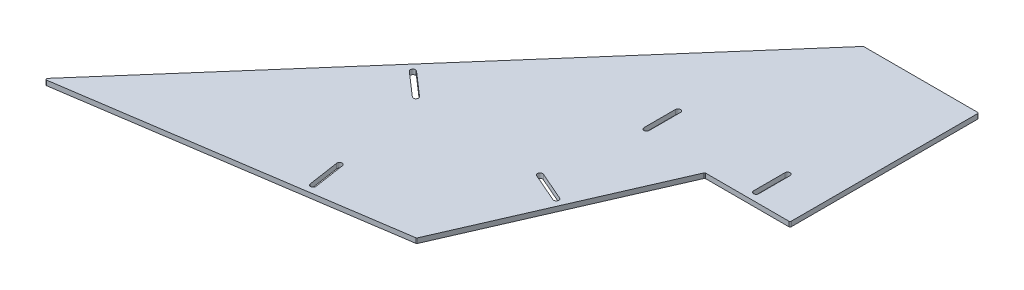
ISO-10303-21;
HEADER;
FILE_DESCRIPTION(('STEP AP214'),'2;1');
FILE_NAME('part.step','',(''),(''),'','','');
FILE_SCHEMA(('AUTOMOTIVE_DESIGN { 1 0 10303 214 1 1 1 1 }'));
ENDSEC;
DATA;
#1=APPLICATION_CONTEXT('core data for automotive mechanical design processes');
#2=APPLICATION_PROTOCOL_DEFINITION('international standard','automotive_design',2000,#1);
#3=PRODUCT_CONTEXT('',#1,'mechanical');
#4=PRODUCT('Part','Part','',(#3));
#5=PRODUCT_RELATED_PRODUCT_CATEGORY('part','',(#4));
#6=PRODUCT_DEFINITION_FORMATION('','',#4);
#7=PRODUCT_DEFINITION_CONTEXT('part definition',#1,'design');
#8=PRODUCT_DEFINITION('design','',#6,#7);
#9=PRODUCT_DEFINITION_SHAPE('','',#8);
#10=(LENGTH_UNIT() NAMED_UNIT(*) SI_UNIT(.MILLI.,.METRE.));
#11=(NAMED_UNIT(*) PLANE_ANGLE_UNIT() SI_UNIT($,.RADIAN.));
#12=(NAMED_UNIT(*) SI_UNIT($,.STERADIAN.) SOLID_ANGLE_UNIT());
#13=UNCERTAINTY_MEASURE_WITH_UNIT(LENGTH_MEASURE(1.E-05),#10,'distance_accuracy_value','');
#14=(GEOMETRIC_REPRESENTATION_CONTEXT(3) GLOBAL_UNCERTAINTY_ASSIGNED_CONTEXT((#13)) GLOBAL_UNIT_ASSIGNED_CONTEXT((#10,
#11,#12)) REPRESENTATION_CONTEXT('',''));
#15=CARTESIAN_POINT('',(0.,0.,0.));
#16=DIRECTION('',(0.,0.,1.));
#17=DIRECTION('',(1.,0.,0.));
#18=AXIS2_PLACEMENT_3D('',#15,#16,#17);
#19=CARTESIAN_POINT('',(-182.906753128615,4.,209.523292901601));
#20=DIRECTION('',(-0.657636413617563,0.,0.753335481365527));
#21=DIRECTION('',(0.753335481365527,0.,0.657636413617563));
#22=AXIS2_PLACEMENT_3D('',#19,#20,#21);
#23=PLANE('',#22);
#24=DIRECTION('',(-0.753335481365527,0.,-0.657636413617563));
#25=VECTOR('',#24,1.);
#26=CARTESIAN_POINT('',(-182.906753128615,0.,209.523292901601));
#27=LINE('',#26,#25);
#28=CARTESIAN_POINT('',(-169.472302741374,0.,221.251114025297));
#29=VERTEX_POINT('',#28);
#30=CARTESIAN_POINT('',(-188.908358160605,0.,204.284094553964));
#31=VERTEX_POINT('',#30);
#32=EDGE_CURVE('E466',#29,#31,#27,.T.);
#33=ORIENTED_EDGE('',*,*,#32,.T.);
#34=DIRECTION('',(0.,-1.,0.));
#35=VECTOR('',#34,1.);
#36=CARTESIAN_POINT('',(-188.908358160605,4.,204.284094553964));
#37=LINE('',#36,#35);
#38=CARTESIAN_POINT('',(-188.908358160605,4.,204.284094553964));
#39=VERTEX_POINT('',#38);
#40=EDGE_CURVE('E290',#39,#31,#37,.T.);
#41=ORIENTED_EDGE('',*,*,#40,.F.);
#42=DIRECTION('',(-0.753335481365527,0.,-0.657636413617563));
#43=VECTOR('',#42,1.);
#44=CARTESIAN_POINT('',(-182.906753128615,4.,209.523292901601));
#45=LINE('',#44,#43);
#46=CARTESIAN_POINT('',(-169.472302741374,4.,221.251114025297));
#47=VERTEX_POINT('',#46);
#48=EDGE_CURVE('E404',#47,#39,#45,.T.);
#49=ORIENTED_EDGE('',*,*,#48,.F.);
#50=DIRECTION('',(0.,-1.,0.));
#51=VECTOR('',#50,1.);
#52=CARTESIAN_POINT('',(-169.472302741374,4.,221.251114025297));
#53=LINE('',#52,#51);
#54=EDGE_CURVE('E478',#47,#29,#53,.T.);
#55=ORIENTED_EDGE('',*,*,#54,.T.);
#56=EDGE_LOOP('',(#33,#41,#49,#55));
#57=FACE_BOUND('',#56,.T.);
#58=ADVANCED_FACE('F41',(#57),#23,.F.);
#59=CARTESIAN_POINT('',(-187.527321692008,4.,202.702090043096));
#60=DIRECTION('',(0.,-1.,0.));
#61=DIRECTION('',(0.,0.,-1.));
#62=AXIS2_PLACEMENT_3D('',#59,#60,#61);
#63=CYLINDRICAL_SURFACE('',#62,2.10000000000001);
#64=CARTESIAN_POINT('',(-187.527321692008,0.,202.702090043096));
#65=DIRECTION('',(0.,1.,0.));
#66=DIRECTION('',(0.,0.,1.));
#67=AXIS2_PLACEMENT_3D('',#64,#65,#66);
#68=CIRCLE('',#67,2.10000000000001);
#69=CARTESIAN_POINT('',(-186.146285223411,0.,201.120085532229));
#70=VERTEX_POINT('',#69);
#71=EDGE_CURVE('E469',#31,#70,#68,.F.);
#72=ORIENTED_EDGE('',*,*,#71,.T.);
#73=DIRECTION('',(0.,-1.,0.));
#74=VECTOR('',#73,1.);
#75=CARTESIAN_POINT('',(-186.146285223411,4.,201.120085532229));
#76=LINE('',#75,#74);
#77=CARTESIAN_POINT('',(-186.146285223411,4.,201.120085532229));
#78=VERTEX_POINT('',#77);
#79=EDGE_CURVE('E484',#78,#70,#76,.T.);
#80=ORIENTED_EDGE('',*,*,#79,.F.);
#81=CARTESIAN_POINT('',(-187.527321692008,4.,202.702090043096));
#82=DIRECTION('',(0.,1.,0.));
#83=DIRECTION('',(0.,0.,1.));
#84=AXIS2_PLACEMENT_3D('',#81,#82,#83);
#85=CIRCLE('',#84,2.10000000000001);
#86=EDGE_CURVE('E407',#39,#78,#85,.F.);
#87=ORIENTED_EDGE('',*,*,#86,.F.);
#88=ORIENTED_EDGE('',*,*,#40,.T.);
#89=EDGE_LOOP('',(#72,#80,#87,#88));
#90=FACE_BOUND('',#89,.T.);
#91=ADVANCED_FACE('F534',(#90),#63,.F.);
#92=CARTESIAN_POINT('',(-180.144680191422,4.,206.359283879866));
#93=DIRECTION('',(-0.657636413617563,0.,0.753335481365527));
#94=DIRECTION('',(0.753335481365527,0.,0.657636413617563));
#95=AXIS2_PLACEMENT_3D('',#92,#93,#94);
#96=PLANE('',#95);
#97=DIRECTION('',(-0.753335481365527,0.,-0.657636413617563));
#98=VECTOR('',#97,1.);
#99=CARTESIAN_POINT('',(-180.144680191422,0.,206.359283879866));
#100=LINE('',#99,#98);
#101=CARTESIAN_POINT('',(-166.71022980418,0.,218.087105003562));
#102=VERTEX_POINT('',#101);
#103=EDGE_CURVE('E472',#102,#70,#100,.T.);
#104=ORIENTED_EDGE('',*,*,#103,.F.);
#105=DIRECTION('',(0.,-1.,0.));
#106=VECTOR('',#105,1.);
#107=CARTESIAN_POINT('',(-166.71022980418,4.,218.087105003562));
#108=LINE('',#107,#106);
#109=CARTESIAN_POINT('',(-166.71022980418,4.,218.087105003562));
#110=VERTEX_POINT('',#109);
#111=EDGE_CURVE('E481',#110,#102,#108,.T.);
#112=ORIENTED_EDGE('',*,*,#111,.F.);
#113=DIRECTION('',(-0.753335481365527,0.,-0.657636413617563));
#114=VECTOR('',#113,1.);
#115=CARTESIAN_POINT('',(-180.144680191422,4.,206.359283879866));
#116=LINE('',#115,#114);
#117=EDGE_CURVE('E409',#110,#78,#116,.T.);
#118=ORIENTED_EDGE('',*,*,#117,.T.);
#119=ORIENTED_EDGE('',*,*,#79,.T.);
#120=EDGE_LOOP('',(#104,#112,#118,#119));
#121=FACE_BOUND('',#120,.T.);
#122=ADVANCED_FACE('F540',(#121),#96,.T.);
#123=CARTESIAN_POINT('',(-193.849616683221,4.,29.0389007895047));
#124=DIRECTION('',(-0.988965179468051,0.,0.148148148148148));
#125=DIRECTION('',(0.148148148148148,0.,0.988965179468051));
#126=AXIS2_PLACEMENT_3D('',#123,#124,#125);
#127=PLANE('',#126);
#128=DIRECTION('',(-0.148148148148148,0.,-0.988965179468051));
#129=VECTOR('',#128,1.);
#130=CARTESIAN_POINT('',(-193.849616683221,0.,29.0389007895047));
#131=LINE('',#130,#129);
#132=CARTESIAN_POINT('',(-149.493127167284,0.,325.14131018874));
#133=VERTEX_POINT('',#132);
#134=CARTESIAN_POINT('',(-153.315349389507,0.,299.626008558464));
#135=VERTEX_POINT('',#134);
#136=EDGE_CURVE('E455',#133,#135,#131,.T.);
#137=ORIENTED_EDGE('',*,*,#136,.T.);
#138=DIRECTION('',(0.,-1.,0.));
#139=VECTOR('',#138,1.);
#140=CARTESIAN_POINT('',(-153.315349389507,4.,299.626008558464));
#141=LINE('',#140,#139);
#142=CARTESIAN_POINT('',(-153.315349389507,4.,299.626008558464));
#143=VERTEX_POINT('',#142);
#144=EDGE_CURVE('E482',#143,#135,#141,.T.);
#145=ORIENTED_EDGE('',*,*,#144,.F.);
#146=DIRECTION('',(-0.148148148148148,0.,-0.988965179468051));
#147=VECTOR('',#146,1.);
#148=CARTESIAN_POINT('',(-193.849616683221,4.,29.0389007895047));
#149=LINE('',#148,#147);
#150=CARTESIAN_POINT('',(-149.493127167284,4.,325.14131018874));
#151=VERTEX_POINT('',#150);
#152=EDGE_CURVE('E394',#151,#143,#149,.T.);
#153=ORIENTED_EDGE('',*,*,#152,.F.);
#154=DIRECTION('',(0.,-1.,0.));
#155=VECTOR('',#154,1.);
#156=CARTESIAN_POINT('',(-149.493127167284,4.,325.14131018874));
#157=LINE('',#156,#155);
#158=EDGE_CURVE('E488',#151,#133,#157,.T.);
#159=ORIENTED_EDGE('',*,*,#158,.T.);
#160=EDGE_LOOP('',(#137,#145,#153,#159));
#161=FACE_BOUND('',#160,.T.);
#162=ADVANCED_FACE('F558',(#161),#127,.F.);
#163=CARTESIAN_POINT('',(-151.238522512624,4.,299.314897447352));
#164=DIRECTION('',(0.,-1.,0.));
#165=DIRECTION('',(0.,0.,-1.));
#166=AXIS2_PLACEMENT_3D('',#163,#164,#165);
#167=CYLINDRICAL_SURFACE('',#166,2.1);
#168=CARTESIAN_POINT('',(-151.238522512624,0.,299.314897447352));
#169=DIRECTION('',(0.,1.,0.));
#170=DIRECTION('',(0.,0.,1.));
#171=AXIS2_PLACEMENT_3D('',#168,#169,#170);
#172=CIRCLE('',#171,2.1);
#173=CARTESIAN_POINT('',(-149.161695635741,0.,299.003786336241));
#174=VERTEX_POINT('',#173);
#175=EDGE_CURVE('E458',#135,#174,#172,.F.);
#176=ORIENTED_EDGE('',*,*,#175,.T.);
#177=DIRECTION('',(0.,-1.,0.));
#178=VECTOR('',#177,1.);
#179=CARTESIAN_POINT('',(-149.161695635741,4.,299.003786336241));
#180=LINE('',#179,#178);
#181=CARTESIAN_POINT('',(-149.161695635741,4.,299.003786336241));
#182=VERTEX_POINT('',#181);
#183=EDGE_CURVE('E494',#182,#174,#180,.T.);
#184=ORIENTED_EDGE('',*,*,#183,.F.);
#185=CARTESIAN_POINT('',(-151.238522512624,4.,299.314897447352));
#186=DIRECTION('',(0.,1.,0.));
#187=DIRECTION('',(0.,0.,1.));
#188=AXIS2_PLACEMENT_3D('',#185,#186,#187);
#189=CIRCLE('',#188,2.1);
#190=EDGE_CURVE('E397',#143,#182,#189,.F.);
#191=ORIENTED_EDGE('',*,*,#190,.F.);
#192=ORIENTED_EDGE('',*,*,#144,.T.);
#193=EDGE_LOOP('',(#176,#184,#191,#192));
#194=FACE_BOUND('',#193,.T.);
#195=ADVANCED_FACE('F554',(#194),#167,.F.);
#196=CARTESIAN_POINT('',(-189.695962929456,4.,28.4166785672828));
#197=DIRECTION('',(-0.988965179468051,0.,0.148148148148149));
#198=DIRECTION('',(0.148148148148149,0.,0.988965179468051));
#199=AXIS2_PLACEMENT_3D('',#196,#197,#198);
#200=PLANE('',#199);
#201=DIRECTION('',(-0.148148148148149,0.,-0.988965179468051));
#202=VECTOR('',#201,1.);
#203=CARTESIAN_POINT('',(-189.695962929456,0.,28.4166785672828));
#204=LINE('',#203,#202);
#205=CARTESIAN_POINT('',(-145.339473413519,0.,324.519087966518));
#206=VERTEX_POINT('',#205);
#207=EDGE_CURVE('E461',#206,#174,#204,.T.);
#208=ORIENTED_EDGE('',*,*,#207,.F.);
#209=DIRECTION('',(0.,-1.,0.));
#210=VECTOR('',#209,1.);
#211=CARTESIAN_POINT('',(-145.339473413519,4.,324.519087966518));
#212=LINE('',#211,#210);
#213=CARTESIAN_POINT('',(-145.339473413519,4.,324.519087966518));
#214=VERTEX_POINT('',#213);
#215=EDGE_CURVE('E491',#214,#206,#212,.T.);
#216=ORIENTED_EDGE('',*,*,#215,.F.);
#217=DIRECTION('',(-0.148148148148149,0.,-0.988965179468051));
#218=VECTOR('',#217,1.);
#219=CARTESIAN_POINT('',(-189.695962929456,4.,28.4166785672828));
#220=LINE('',#219,#218);
#221=EDGE_CURVE('E399',#214,#182,#220,.T.);
#222=ORIENTED_EDGE('',*,*,#221,.T.);
#223=ORIENTED_EDGE('',*,*,#183,.T.);
#224=EDGE_LOOP('',(#208,#216,#222,#223));
#225=FACE_BOUND('',#224,.T.);
#226=ADVANCED_FACE('F550',(#225),#200,.T.);
#227=CARTESIAN_POINT('',(-52.4097612314147,4.,0.));
#228=DIRECTION('',(-1.,0.,0.));
#229=DIRECTION('',(0.,0.,1.));
#230=AXIS2_PLACEMENT_3D('',#227,#228,#229);
#231=PLANE('',#230);
#232=DIRECTION('',(0.,0.,-1.));
#233=VECTOR('',#232,1.);
#234=CARTESIAN_POINT('',(-52.4097612314147,0.,0.));
#235=LINE('',#234,#233);
#236=CARTESIAN_POINT('',(-52.4097612314147,0.,147.9));
#237=VERTEX_POINT('',#236);
#238=CARTESIAN_POINT('',(-52.4097612314147,0.,122.1));
#239=VERTEX_POINT('',#238);
#240=EDGE_CURVE('E444',#237,#239,#235,.T.);
#241=ORIENTED_EDGE('',*,*,#240,.T.);
#242=DIRECTION('',(0.,-1.,0.));
#243=VECTOR('',#242,1.);
#244=CARTESIAN_POINT('',(-52.4097612314147,4.,122.1));
#245=LINE('',#244,#243);
#246=CARTESIAN_POINT('',(-52.4097612314147,4.,122.1));
#247=VERTEX_POINT('',#246);
#248=EDGE_CURVE('E492',#247,#239,#245,.T.);
#249=ORIENTED_EDGE('',*,*,#248,.F.);
#250=DIRECTION('',(0.,0.,-1.));
#251=VECTOR('',#250,1.);
#252=CARTESIAN_POINT('',(-52.4097612314147,4.,0.));
#253=LINE('',#252,#251);
#254=CARTESIAN_POINT('',(-52.4097612314147,4.,147.9));
#255=VERTEX_POINT('',#254);
#256=EDGE_CURVE('E384',#255,#247,#253,.T.);
#257=ORIENTED_EDGE('',*,*,#256,.F.);
#258=DIRECTION('',(0.,-1.,0.));
#259=VECTOR('',#258,1.);
#260=CARTESIAN_POINT('',(-52.4097612314147,4.,147.9));
#261=LINE('',#260,#259);
#262=EDGE_CURVE('E498',#255,#237,#261,.T.);
#263=ORIENTED_EDGE('',*,*,#262,.T.);
#264=EDGE_LOOP('',(#241,#249,#257,#263));
#265=FACE_BOUND('',#264,.T.);
#266=ADVANCED_FACE('F553',(#265),#231,.F.);
#267=CARTESIAN_POINT('',(-50.3097612314147,4.,122.1));
#268=DIRECTION('',(0.,-1.,0.));
#269=DIRECTION('',(0.,0.,-1.));
#270=AXIS2_PLACEMENT_3D('',#267,#268,#269);
#271=CYLINDRICAL_SURFACE('',#270,2.09999999999999);
#272=CARTESIAN_POINT('',(-50.3097612314147,0.,122.1));
#273=DIRECTION('',(0.,1.,0.));
#274=DIRECTION('',(0.,0.,1.));
#275=AXIS2_PLACEMENT_3D('',#272,#273,#274);
#276=CIRCLE('',#275,2.09999999999999);
#277=CARTESIAN_POINT('',(-48.2097612314147,0.,122.1));
#278=VERTEX_POINT('',#277);
#279=EDGE_CURVE('E447',#239,#278,#276,.F.);
#280=ORIENTED_EDGE('',*,*,#279,.T.);
#281=DIRECTION('',(0.,-1.,0.));
#282=VECTOR('',#281,1.);
#283=CARTESIAN_POINT('',(-48.2097612314147,4.,122.1));
#284=LINE('',#283,#282);
#285=CARTESIAN_POINT('',(-48.2097612314147,4.,122.1));
#286=VERTEX_POINT('',#285);
#287=EDGE_CURVE('E504',#286,#278,#284,.T.);
#288=ORIENTED_EDGE('',*,*,#287,.F.);
#289=CARTESIAN_POINT('',(-50.3097612314147,4.,122.1));
#290=DIRECTION('',(0.,1.,0.));
#291=DIRECTION('',(0.,0.,1.));
#292=AXIS2_PLACEMENT_3D('',#289,#290,#291);
#293=CIRCLE('',#292,2.09999999999999);
#294=EDGE_CURVE('E387',#247,#286,#293,.F.);
#295=ORIENTED_EDGE('',*,*,#294,.F.);
#296=ORIENTED_EDGE('',*,*,#248,.T.);
#297=EDGE_LOOP('',(#280,#288,#295,#296));
#298=FACE_BOUND('',#297,.T.);
#299=ADVANCED_FACE('F571',(#298),#271,.F.);
#300=CARTESIAN_POINT('',(-48.2097612314147,4.,0.));
#301=DIRECTION('',(-1.,0.,0.));
#302=DIRECTION('',(0.,0.,1.));
#303=AXIS2_PLACEMENT_3D('',#300,#301,#302);
#304=PLANE('',#303);
#305=DIRECTION('',(0.,0.,-1.));
#306=VECTOR('',#305,1.);
#307=CARTESIAN_POINT('',(-48.2097612314147,0.,0.));
#308=LINE('',#307,#306);
#309=CARTESIAN_POINT('',(-48.2097612314147,0.,147.9));
#310=VERTEX_POINT('',#309);
#311=EDGE_CURVE('E450',#310,#278,#308,.T.);
#312=ORIENTED_EDGE('',*,*,#311,.F.);
#313=DIRECTION('',(0.,-1.,0.));
#314=VECTOR('',#313,1.);
#315=CARTESIAN_POINT('',(-48.2097612314147,4.,147.9));
#316=LINE('',#315,#314);
#317=CARTESIAN_POINT('',(-48.2097612314147,4.,147.9));
#318=VERTEX_POINT('',#317);
#319=EDGE_CURVE('E501',#318,#310,#316,.T.);
#320=ORIENTED_EDGE('',*,*,#319,.F.);
#321=DIRECTION('',(0.,0.,-1.));
#322=VECTOR('',#321,1.);
#323=CARTESIAN_POINT('',(-48.2097612314147,4.,0.));
#324=LINE('',#323,#322);
#325=EDGE_CURVE('E389',#318,#286,#324,.T.);
#326=ORIENTED_EDGE('',*,*,#325,.T.);
#327=ORIENTED_EDGE('',*,*,#287,.T.);
#328=EDGE_LOOP('',(#312,#320,#326,#327));
#329=FACE_BOUND('',#328,.T.);
#330=ADVANCED_FACE('F567',(#329),#304,.T.);
#331=CARTESIAN_POINT('',(-92.8428489939998,4.,212.949794831106));
#332=DIRECTION('',(-0.399652626942728,0.,0.916666666666666));
#333=DIRECTION('',(0.916666666666666,0.,0.399652626942728));
#334=AXIS2_PLACEMENT_3D('',#331,#332,#333);
#335=PLANE('',#334);
#336=DIRECTION('',(-0.916666666666666,0.,-0.399652626942728));
#337=VECTOR('',#336,1.);
#338=CARTESIAN_POINT('',(-92.8428489939998,0.,212.949794831106));
#339=LINE('',#338,#337);
#340=CARTESIAN_POINT('',(-38.6261015061731,0.,236.587466348707));
#341=VERTEX_POINT('',#340);
#342=CARTESIAN_POINT('',(-62.2761015061736,0.,226.276428573584));
#343=VERTEX_POINT('',#342);
#344=EDGE_CURVE('E433',#341,#343,#339,.T.);
#345=ORIENTED_EDGE('',*,*,#344,.T.);
#346=DIRECTION('',(0.,-1.,0.));
#347=VECTOR('',#346,1.);
#348=CARTESIAN_POINT('',(-62.2761015061736,4.,226.276428573584));
#349=LINE('',#348,#347);
#350=CARTESIAN_POINT('',(-62.2761015061736,4.,226.276428573584));
#351=VERTEX_POINT('',#350);
#352=EDGE_CURVE('E502',#351,#343,#349,.T.);
#353=ORIENTED_EDGE('',*,*,#352,.F.);
#354=DIRECTION('',(-0.916666666666666,0.,-0.399652626942728));
#355=VECTOR('',#354,1.);
#356=CARTESIAN_POINT('',(-92.8428489939998,4.,212.949794831106));
#357=LINE('',#356,#355);
#358=CARTESIAN_POINT('',(-38.6261015061731,4.,236.587466348707));
#359=VERTEX_POINT('',#358);
#360=EDGE_CURVE('E374',#359,#351,#357,.T.);
#361=ORIENTED_EDGE('',*,*,#360,.F.);
#362=DIRECTION('',(0.,-1.,0.));
#363=VECTOR('',#362,1.);
#364=CARTESIAN_POINT('',(-38.6261015061731,4.,236.587466348707));
#365=LINE('',#364,#363);
#366=EDGE_CURVE('E278',#359,#341,#365,.T.);
#367=ORIENTED_EDGE('',*,*,#366,.T.);
#368=EDGE_LOOP('',(#345,#353,#361,#367));
#369=FACE_BOUND('',#368,.T.);
#370=ADVANCED_FACE('F570',(#369),#335,.F.);
#371=CARTESIAN_POINT('',(-61.4368309895938,4.,224.351428573584));
#372=DIRECTION('',(0.,-1.,0.));
#373=DIRECTION('',(0.,0.,-1.));
#374=AXIS2_PLACEMENT_3D('',#371,#372,#373);
#375=CYLINDRICAL_SURFACE('',#374,2.1);
#376=CARTESIAN_POINT('',(-61.4368309895938,0.,224.351428573584));
#377=DIRECTION('',(0.,1.,0.));
#378=DIRECTION('',(0.,0.,1.));
#379=AXIS2_PLACEMENT_3D('',#376,#377,#378);
#380=CIRCLE('',#379,2.1);
#381=CARTESIAN_POINT('',(-60.5975604730141,0.,222.426428573584));
#382=VERTEX_POINT('',#381);
#383=EDGE_CURVE('E436',#343,#382,#380,.F.);
#384=ORIENTED_EDGE('',*,*,#383,.T.);
#385=DIRECTION('',(0.,-1.,0.));
#386=VECTOR('',#385,1.);
#387=CARTESIAN_POINT('',(-60.5975604730141,4.,222.426428573584));
#388=LINE('',#387,#386);
#389=CARTESIAN_POINT('',(-60.5975604730141,4.,222.426428573584));
#390=VERTEX_POINT('',#389);
#391=EDGE_CURVE('E509',#390,#382,#388,.T.);
#392=ORIENTED_EDGE('',*,*,#391,.F.);
#393=CARTESIAN_POINT('',(-61.4368309895938,4.,224.351428573584));
#394=DIRECTION('',(0.,1.,0.));
#395=DIRECTION('',(0.,0.,1.));
#396=AXIS2_PLACEMENT_3D('',#393,#394,#395);
#397=CIRCLE('',#396,2.1);
#398=EDGE_CURVE('E377',#351,#390,#397,.F.);
#399=ORIENTED_EDGE('',*,*,#398,.F.);
#400=ORIENTED_EDGE('',*,*,#352,.T.);
#401=EDGE_LOOP('',(#384,#392,#399,#400));
#402=FACE_BOUND('',#401,.T.);
#403=ADVANCED_FACE('F585',(#402),#375,.F.);
#404=CARTESIAN_POINT('',(-91.16430796084,4.,209.099794831106));
#405=DIRECTION('',(-0.399652626942726,0.,0.916666666666667));
#406=DIRECTION('',(0.916666666666667,0.,0.399652626942726));
#407=AXIS2_PLACEMENT_3D('',#404,#405,#406);
#408=PLANE('',#407);
#409=DIRECTION('',(-0.916666666666667,0.,-0.399652626942726));
#410=VECTOR('',#409,1.);
#411=CARTESIAN_POINT('',(-91.16430796084,0.,209.099794831106));
#412=LINE('',#411,#410);
#413=CARTESIAN_POINT('',(-36.9475604730137,0.,232.737466348707));
#414=VERTEX_POINT('',#413);
#415=EDGE_CURVE('E439',#414,#382,#412,.T.);
#416=ORIENTED_EDGE('',*,*,#415,.F.);
#417=DIRECTION('',(0.,-1.,0.));
#418=VECTOR('',#417,1.);
#419=CARTESIAN_POINT('',(-36.9475604730137,4.,232.737466348707));
#420=LINE('',#419,#418);
#421=CARTESIAN_POINT('',(-36.9475604730137,4.,232.737466348707));
#422=VERTEX_POINT('',#421);
#423=EDGE_CURVE('E281',#422,#414,#420,.T.);
#424=ORIENTED_EDGE('',*,*,#423,.F.);
#425=DIRECTION('',(-0.916666666666667,0.,-0.399652626942726));
#426=VECTOR('',#425,1.);
#427=CARTESIAN_POINT('',(-91.16430796084,4.,209.099794831106));
#428=LINE('',#427,#426);
#429=EDGE_CURVE('E379',#422,#390,#428,.T.);
#430=ORIENTED_EDGE('',*,*,#429,.T.);
#431=ORIENTED_EDGE('',*,*,#391,.T.);
#432=EDGE_LOOP('',(#416,#424,#430,#431));
#433=FACE_BOUND('',#432,.T.);
#434=ADVANCED_FACE('F582',(#433),#408,.T.);
#435=CARTESIAN_POINT('',(37.5902387685853,4.,0.));
#436=DIRECTION('',(-1.,0.,0.));
#437=DIRECTION('',(0.,0.,1.));
#438=AXIS2_PLACEMENT_3D('',#435,#436,#437);
#439=PLANE('',#438);
#440=DIRECTION('',(0.,0.,-1.));
#441=VECTOR('',#440,1.);
#442=CARTESIAN_POINT('',(37.5902387685853,0.,0.));
#443=LINE('',#442,#441);
#444=CARTESIAN_POINT('',(37.5902387685853,0.,147.9));
#445=VERTEX_POINT('',#444);
#446=CARTESIAN_POINT('',(37.5902387685853,0.,122.1));
#447=VERTEX_POINT('',#446);
#448=EDGE_CURVE('E277',#445,#447,#443,.T.);
#449=ORIENTED_EDGE('',*,*,#448,.T.);
#450=DIRECTION('',(0.,-1.,0.));
#451=VECTOR('',#450,1.);
#452=CARTESIAN_POINT('',(37.5902387685853,4.,122.1));
#453=LINE('',#452,#451);
#454=CARTESIAN_POINT('',(37.5902387685853,4.,122.1));
#455=VERTEX_POINT('',#454);
#456=EDGE_CURVE('E256',#455,#447,#453,.T.);
#457=ORIENTED_EDGE('',*,*,#456,.F.);
#458=DIRECTION('',(0.,0.,-1.));
#459=VECTOR('',#458,1.);
#460=CARTESIAN_POINT('',(37.5902387685853,4.,0.));
#461=LINE('',#460,#459);
#462=CARTESIAN_POINT('',(37.5902387685853,4.,147.9));
#463=VERTEX_POINT('',#462);
#464=EDGE_CURVE('E263',#463,#455,#461,.T.);
#465=ORIENTED_EDGE('',*,*,#464,.F.);
#466=DIRECTION('',(0.,-1.,0.));
#467=VECTOR('',#466,1.);
#468=CARTESIAN_POINT('',(37.5902387685853,4.,147.9));
#469=LINE('',#468,#467);
#470=EDGE_CURVE('E414',#463,#445,#469,.T.);
#471=ORIENTED_EDGE('',*,*,#470,.T.);
#472=EDGE_LOOP('',(#449,#457,#465,#471));
#473=FACE_BOUND('',#472,.T.);
#474=ADVANCED_FACE('F275',(#473),#439,.F.);
#475=CARTESIAN_POINT('',(39.6902387685853,4.,122.1));
#476=DIRECTION('',(0.,-1.,0.));
#477=DIRECTION('',(0.,0.,-1.));
#478=AXIS2_PLACEMENT_3D('',#475,#476,#477);
#479=CYLINDRICAL_SURFACE('',#478,2.09999999999999);
#480=CARTESIAN_POINT('',(39.6902387685853,0.,122.1));
#481=DIRECTION('',(0.,1.,0.));
#482=DIRECTION('',(0.,0.,1.));
#483=AXIS2_PLACEMENT_3D('',#480,#481,#482);
#484=CIRCLE('',#483,2.09999999999999);
#485=CARTESIAN_POINT('',(41.7902387685853,0.,122.1));
#486=VERTEX_POINT('',#485);
#487=EDGE_CURVE('E426',#447,#486,#484,.F.);
#488=ORIENTED_EDGE('',*,*,#487,.T.);
#489=DIRECTION('',(0.,-1.,0.));
#490=VECTOR('',#489,1.);
#491=CARTESIAN_POINT('',(41.7902387685853,4.,122.1));
#492=LINE('',#491,#490);
#493=CARTESIAN_POINT('',(41.7902387685853,4.,122.1));
#494=VERTEX_POINT('',#493);
#495=EDGE_CURVE('E258',#494,#486,#492,.T.);
#496=ORIENTED_EDGE('',*,*,#495,.F.);
#497=CARTESIAN_POINT('',(39.6902387685853,4.,122.1));
#498=DIRECTION('',(0.,1.,0.));
#499=DIRECTION('',(0.,0.,1.));
#500=AXIS2_PLACEMENT_3D('',#497,#498,#499);
#501=CIRCLE('',#500,2.09999999999999);
#502=EDGE_CURVE('E251',#455,#494,#501,.F.);
#503=ORIENTED_EDGE('',*,*,#502,.F.);
#504=ORIENTED_EDGE('',*,*,#456,.T.);
#505=EDGE_LOOP('',(#488,#496,#503,#504));
#506=FACE_BOUND('',#505,.T.);
#507=ADVANCED_FACE('F254',(#506),#479,.F.);
#508=CARTESIAN_POINT('',(41.7902387685853,4.,0.));
#509=DIRECTION('',(-1.,0.,0.));
#510=DIRECTION('',(0.,0.,1.));
#511=AXIS2_PLACEMENT_3D('',#508,#509,#510);
#512=PLANE('',#511);
#513=DIRECTION('',(0.,0.,-1.));
#514=VECTOR('',#513,1.);
#515=CARTESIAN_POINT('',(41.7902387685853,0.,0.));
#516=LINE('',#515,#514);
#517=CARTESIAN_POINT('',(41.7902387685853,0.,147.9));
#518=VERTEX_POINT('',#517);
#519=EDGE_CURVE('E428',#518,#486,#516,.T.);
#520=ORIENTED_EDGE('',*,*,#519,.F.);
#521=DIRECTION('',(0.,-1.,0.));
#522=VECTOR('',#521,1.);
#523=CARTESIAN_POINT('',(41.7902387685853,4.,147.9));
#524=LINE('',#523,#522);
#525=CARTESIAN_POINT('',(41.7902387685853,4.,147.9));
#526=VERTEX_POINT('',#525);
#527=EDGE_CURVE('E283',#526,#518,#524,.T.);
#528=ORIENTED_EDGE('',*,*,#527,.F.);
#529=DIRECTION('',(0.,0.,-1.));
#530=VECTOR('',#529,1.);
#531=CARTESIAN_POINT('',(41.7902387685853,4.,0.));
#532=LINE('',#531,#530);
#533=EDGE_CURVE('E262',#526,#494,#532,.T.);
#534=ORIENTED_EDGE('',*,*,#533,.T.);
#535=ORIENTED_EDGE('',*,*,#495,.T.);
#536=EDGE_LOOP('',(#520,#528,#534,#535));
#537=FACE_BOUND('',#536,.T.);
#538=ADVANCED_FACE('F519',(#537),#512,.T.);
#539=CARTESIAN_POINT('',(-11.3502869496846,4.,-9.90841688432172));
#540=DIRECTION('',(-0.753335481365527,0.,-0.657636413617563));
#541=DIRECTION('',(-0.657636413617563,0.,0.753335481365527));
#542=AXIS2_PLACEMENT_3D('',#539,#540,#541);
#543=PLANE('',#542);
#544=DIRECTION('',(0.657636413617563,0.,-0.753335481365527));
#545=VECTOR('',#544,1.);
#546=CARTESIAN_POINT('',(-11.3502869496846,4.,-9.90841688432172));
#547=LINE('',#546,#545);
#548=CARTESIAN_POINT('',(-332.478526802052,4.,357.950314992302));
#549=VERTEX_POINT('',#548);
#550=CARTESIAN_POINT('',(-20.2988718395338,4.,0.342363586382441));
#551=VERTEX_POINT('',#550);
#552=EDGE_CURVE('E477',#549,#551,#547,.T.);
#553=ORIENTED_EDGE('',*,*,#552,.T.);
#554=DIRECTION('',(0.,-1.,0.));
#555=VECTOR('',#554,1.);
#556=CARTESIAN_POINT('',(-20.2988718395338,0.,0.342363586382439));
#557=LINE('',#556,#555);
#558=CARTESIAN_POINT('',(-20.2988718395338,0.,0.342363586382441));
#559=VERTEX_POINT('',#558);
#560=EDGE_CURVE('E289',#551,#559,#557,.T.);
#561=ORIENTED_EDGE('',*,*,#560,.T.);
#562=DIRECTION('',(0.657636413617563,0.,-0.753335481365527));
#563=VECTOR('',#562,1.);
#564=CARTESIAN_POINT('',(-11.3502869496846,0.,-9.90841688432172));
#565=LINE('',#564,#563);
#566=CARTESIAN_POINT('',(-332.478526802052,0.,357.950314992302));
#567=VERTEX_POINT('',#566);
#568=EDGE_CURVE('E415',#567,#559,#565,.T.);
#569=ORIENTED_EDGE('',*,*,#568,.F.);
#570=DIRECTION('',(0.,-1.,0.));
#571=VECTOR('',#570,1.);
#572=CARTESIAN_POINT('',(-332.478526802052,4.,357.950314992302));
#573=LINE('',#572,#571);
#574=EDGE_CURVE('E287',#567,#549,#573,.F.);
#575=ORIENTED_EDGE('',*,*,#574,.T.);
#576=EDGE_LOOP('',(#553,#561,#569,#575));
#577=FACE_BOUND('',#576,.T.);
#578=ADVANCED_FACE('F521',(#577),#543,.T.);
#579=CARTESIAN_POINT('',(45.4083413677889,4.,303.124062173458));
#580=DIRECTION('',(0.148148148148148,0.,0.988965179468051));
#581=DIRECTION('',(0.988965179468051,0.,-0.148148148148148));
#582=AXIS2_PLACEMENT_3D('',#579,#580,#581);
#583=PLANE('',#582);
#584=DIRECTION('',(-0.988965179468051,0.,0.148148148148148));
#585=VECTOR('',#584,1.);
#586=CARTESIAN_POINT('',(45.4083413677889,4.,303.124062173458));
#587=LINE('',#586,#585);
#588=CARTESIAN_POINT('',(-67.7945683087687,4.,320.081991311656));
#589=VERTEX_POINT('',#588);
#590=CARTESIAN_POINT('',(-331.577043172539,4.,359.596916585388));
#591=VERTEX_POINT('',#590);
#592=EDGE_CURVE('E367',#589,#591,#587,.T.);
#593=ORIENTED_EDGE('',*,*,#592,.T.);
#594=DIRECTION('',(0.,-1.,0.));
#595=VECTOR('',#594,1.);
#596=CARTESIAN_POINT('',(-331.577043172538,4.,359.596916585388));
#597=LINE('',#596,#595);
#598=CARTESIAN_POINT('',(-331.577043172539,0.,359.596916585388));
#599=VERTEX_POINT('',#598);
#600=EDGE_CURVE('E328',#591,#599,#597,.T.);
#601=ORIENTED_EDGE('',*,*,#600,.T.);
#602=DIRECTION('',(-0.988965179468051,0.,0.148148148148148));
#603=VECTOR('',#602,1.);
#604=CARTESIAN_POINT('',(45.4083413677889,0.,303.124062173458));
#605=LINE('',#604,#603);
#606=CARTESIAN_POINT('',(-67.7945683087687,0.,320.081991311656));
#607=VERTEX_POINT('',#606);
#608=EDGE_CURVE('E353',#607,#599,#605,.T.);
#609=ORIENTED_EDGE('',*,*,#608,.F.);
#610=DIRECTION('',(0.,-1.,0.));
#611=VECTOR('',#610,1.);
#612=CARTESIAN_POINT('',(-67.7945683087687,4.,320.081991311656));
#613=LINE('',#612,#611);
#614=EDGE_CURVE('E326',#607,#589,#613,.F.);
#615=ORIENTED_EDGE('',*,*,#614,.T.);
#616=EDGE_LOOP('',(#593,#601,#609,#615));
#617=FACE_BOUND('',#616,.T.);
#618=ADVANCED_FACE('F528',(#617),#583,.T.);
#619=CARTESIAN_POINT('',(60.7250808211598,4.,26.4752051688937));
#620=DIRECTION('',(0.916666666666667,0.,0.399652626942726));
#621=DIRECTION('',(0.399652626942726,0.,-0.916666666666667));
#622=AXIS2_PLACEMENT_3D('',#619,#620,#621);
#623=PLANE('',#622);
#624=DIRECTION('',(-0.399652626942726,0.,0.916666666666667));
#625=VECTOR('',#624,1.);
#626=CARTESIAN_POINT('',(60.7250808211598,0.,26.4752051688937));
#627=LINE('',#626,#625);
#628=CARTESIAN_POINT('',(4.42849650889019,0.,155.600347373057));
#629=VERTEX_POINT('',#628);
#630=CARTESIAN_POINT('',(-67.0260497902502,0.,319.492678759131));
#631=VERTEX_POINT('',#630);
#632=EDGE_CURVE('E342',#629,#631,#627,.T.);
#633=ORIENTED_EDGE('',*,*,#632,.F.);
#634=DIRECTION('',(0.,-1.,0.));
#635=VECTOR('',#634,1.);
#636=CARTESIAN_POINT('',(4.42849650889019,4.,155.600347373057));
#637=LINE('',#636,#635);
#638=CARTESIAN_POINT('',(4.42849650889019,4.,155.600347373057));
#639=VERTEX_POINT('',#638);
#640=EDGE_CURVE('E334',#629,#639,#637,.F.);
#641=ORIENTED_EDGE('',*,*,#640,.T.);
#642=DIRECTION('',(-0.399652626942726,0.,0.916666666666667));
#643=VECTOR('',#642,1.);
#644=CARTESIAN_POINT('',(60.7250808211598,4.,26.4752051688937));
#645=LINE('',#644,#643);
#646=CARTESIAN_POINT('',(-67.0260497902502,4.,319.492678759131));
#647=VERTEX_POINT('',#646);
#648=EDGE_CURVE('E360',#639,#647,#645,.T.);
#649=ORIENTED_EDGE('',*,*,#648,.T.);
#650=DIRECTION('',(0.,-1.,0.));
#651=VECTOR('',#650,1.);
#652=CARTESIAN_POINT('',(-67.0260497902502,4.,319.492678759131));
#653=LINE('',#652,#651);
#654=EDGE_CURVE('E331',#647,#631,#653,.T.);
#655=ORIENTED_EDGE('',*,*,#654,.T.);
#656=EDGE_LOOP('',(#633,#641,#649,#655));
#657=FACE_BOUND('',#656,.T.);
#658=ADVANCED_FACE('F349',(#657),#623,.T.);
#659=CARTESIAN_POINT('',(0.,4.,155.));
#660=DIRECTION('',(0.,0.,-1.));
#661=DIRECTION('',(-1.,0.,0.));
#662=AXIS2_PLACEMENT_3D('',#659,#660,#661);
#663=PLANE('',#662);
#664=DIRECTION('',(1.,0.,0.));
#665=VECTOR('',#664,1.);
#666=CARTESIAN_POINT('',(0.,0.,155.));
#667=LINE('',#666,#665);
#668=CARTESIAN_POINT('',(5.34516317555687,0.,155.));
#669=VERTEX_POINT('',#668);
#670=CARTESIAN_POINT('',(73.6902387685853,0.,155.));
#671=VERTEX_POINT('',#670);
#672=EDGE_CURVE('E344',#669,#671,#667,.T.);
#673=ORIENTED_EDGE('',*,*,#672,.T.);
#674=DIRECTION('',(0.,-1.,0.));
#675=VECTOR('',#674,1.);
#676=CARTESIAN_POINT('',(73.6902387685853,4.,155.));
#677=LINE('',#676,#675);
#678=CARTESIAN_POINT('',(73.6902387685853,4.,155.));
#679=VERTEX_POINT('',#678);
#680=EDGE_CURVE('E324',#671,#679,#677,.F.);
#681=ORIENTED_EDGE('',*,*,#680,.T.);
#682=DIRECTION('',(1.,0.,0.));
#683=VECTOR('',#682,1.);
#684=CARTESIAN_POINT('',(0.,4.,155.));
#685=LINE('',#684,#683);
#686=CARTESIAN_POINT('',(5.34516317555687,4.,155.));
#687=VERTEX_POINT('',#686);
#688=EDGE_CURVE('E359',#687,#679,#685,.T.);
#689=ORIENTED_EDGE('',*,*,#688,.F.);
#690=DIRECTION('',(0.,-1.,0.));
#691=VECTOR('',#690,1.);
#692=CARTESIAN_POINT('',(5.34516317555687,4.,155.));
#693=LINE('',#692,#691);
#694=EDGE_CURVE('E321',#687,#669,#693,.T.);
#695=ORIENTED_EDGE('',*,*,#694,.T.);
#696=EDGE_LOOP('',(#673,#681,#689,#695));
#697=FACE_BOUND('',#696,.T.);
#698=ADVANCED_FACE('F362',(#697),#663,.F.);
#699=CARTESIAN_POINT('',(74.6902387685853,4.,0.));
#700=DIRECTION('',(-1.,0.,0.));
#701=DIRECTION('',(0.,0.,1.));
#702=AXIS2_PLACEMENT_3D('',#699,#700,#701);
#703=PLANE('',#702);
#704=DIRECTION('',(0.,0.,-1.));
#705=VECTOR('',#704,1.);
#706=CARTESIAN_POINT('',(74.6902387685853,0.,0.));
#707=LINE('',#706,#705);
#708=CARTESIAN_POINT('',(74.6902387685853,0.,154.));
#709=VERTEX_POINT('',#708);
#710=CARTESIAN_POINT('',(74.6902387685853,0.,1.));
#711=VERTEX_POINT('',#710);
#712=EDGE_CURVE('E420',#709,#711,#707,.T.);
#713=ORIENTED_EDGE('',*,*,#712,.T.);
#714=DIRECTION('',(0.,-1.,0.));
#715=VECTOR('',#714,1.);
#716=CARTESIAN_POINT('',(74.6902387685853,4.,1.));
#717=LINE('',#716,#715);
#718=CARTESIAN_POINT('',(74.6902387685853,4.,1.));
#719=VERTEX_POINT('',#718);
#720=EDGE_CURVE('E56',#711,#719,#717,.F.);
#721=ORIENTED_EDGE('',*,*,#720,.T.);
#722=DIRECTION('',(0.,0.,-1.));
#723=VECTOR('',#722,1.);
#724=CARTESIAN_POINT('',(74.6902387685853,4.,0.));
#725=LINE('',#724,#723);
#726=CARTESIAN_POINT('',(74.6902387685853,4.,154.));
#727=VERTEX_POINT('',#726);
#728=EDGE_CURVE('E364',#727,#719,#725,.T.);
#729=ORIENTED_EDGE('',*,*,#728,.F.);
#730=DIRECTION('',(0.,-1.,0.));
#731=VECTOR('',#730,1.);
#732=CARTESIAN_POINT('',(74.6902387685853,4.,154.));
#733=LINE('',#732,#731);
#734=EDGE_CURVE('E317',#727,#709,#733,.T.);
#735=ORIENTED_EDGE('',*,*,#734,.T.);
#736=EDGE_LOOP('',(#713,#721,#729,#735));
#737=FACE_BOUND('',#736,.T.);
#738=ADVANCED_FACE('F548',(#737),#703,.F.);
#739=CARTESIAN_POINT('',(-147.416300290401,4.,324.830199077629));
#740=DIRECTION('',(0.,-1.,0.));
#741=DIRECTION('',(0.,0.,-1.));
#742=AXIS2_PLACEMENT_3D('',#739,#740,#741);
#743=CYLINDRICAL_SURFACE('',#742,2.10000000000001);
#744=CARTESIAN_POINT('',(-147.416300290401,0.,324.830199077629));
#745=DIRECTION('',(0.,1.,0.));
#746=DIRECTION('',(0.,0.,1.));
#747=AXIS2_PLACEMENT_3D('',#744,#745,#746);
#748=CIRCLE('',#747,2.10000000000001);
#749=EDGE_CURVE('E464',#206,#133,#748,.F.);
#750=ORIENTED_EDGE('',*,*,#749,.T.);
#751=ORIENTED_EDGE('',*,*,#158,.F.);
#752=CARTESIAN_POINT('',(-147.416300290401,4.,324.830199077629));
#753=DIRECTION('',(0.,1.,0.));
#754=DIRECTION('',(0.,0.,1.));
#755=AXIS2_PLACEMENT_3D('',#752,#753,#754);
#756=CIRCLE('',#755,2.10000000000001);
#757=EDGE_CURVE('E402',#214,#151,#756,.F.);
#758=ORIENTED_EDGE('',*,*,#757,.F.);
#759=ORIENTED_EDGE('',*,*,#215,.T.);
#760=EDGE_LOOP('',(#750,#751,#758,#759));
#761=FACE_BOUND('',#760,.T.);
#762=ADVANCED_FACE('F545',(#761),#743,.F.);
#763=CARTESIAN_POINT('',(-50.3097612314147,4.,147.9));
#764=DIRECTION('',(0.,-1.,0.));
#765=DIRECTION('',(0.,0.,-1.));
#766=AXIS2_PLACEMENT_3D('',#763,#764,#765);
#767=CYLINDRICAL_SURFACE('',#766,2.09999999999999);
#768=CARTESIAN_POINT('',(-50.3097612314147,0.,147.9));
#769=DIRECTION('',(0.,1.,0.));
#770=DIRECTION('',(0.,0.,1.));
#771=AXIS2_PLACEMENT_3D('',#768,#769,#770);
#772=CIRCLE('',#771,2.09999999999999);
#773=EDGE_CURVE('E453',#310,#237,#772,.F.);
#774=ORIENTED_EDGE('',*,*,#773,.T.);
#775=ORIENTED_EDGE('',*,*,#262,.F.);
#776=CARTESIAN_POINT('',(-50.3097612314147,4.,147.9));
#777=DIRECTION('',(0.,1.,0.));
#778=DIRECTION('',(0.,0.,1.));
#779=AXIS2_PLACEMENT_3D('',#776,#777,#778);
#780=CIRCLE('',#779,2.09999999999999);
#781=EDGE_CURVE('E392',#318,#255,#780,.F.);
#782=ORIENTED_EDGE('',*,*,#781,.F.);
#783=ORIENTED_EDGE('',*,*,#319,.T.);
#784=EDGE_LOOP('',(#774,#775,#782,#783));
#785=FACE_BOUND('',#784,.T.);
#786=ADVANCED_FACE('F547',(#785),#767,.F.);
#787=CARTESIAN_POINT('',(-37.7868309895934,4.,234.662466348707));
#788=DIRECTION('',(0.,-1.,0.));
#789=DIRECTION('',(0.,0.,-1.));
#790=AXIS2_PLACEMENT_3D('',#787,#788,#789);
#791=CYLINDRICAL_SURFACE('',#790,2.10000000000002);
#792=CARTESIAN_POINT('',(-37.7868309895934,0.,234.662466348707));
#793=DIRECTION('',(0.,1.,0.));
#794=DIRECTION('',(0.,0.,1.));
#795=AXIS2_PLACEMENT_3D('',#792,#793,#794);
#796=CIRCLE('',#795,2.10000000000002);
#797=EDGE_CURVE('E442',#414,#341,#796,.F.);
#798=ORIENTED_EDGE('',*,*,#797,.T.);
#799=ORIENTED_EDGE('',*,*,#366,.F.);
#800=CARTESIAN_POINT('',(-37.7868309895934,4.,234.662466348707));
#801=DIRECTION('',(0.,1.,0.));
#802=DIRECTION('',(0.,0.,1.));
#803=AXIS2_PLACEMENT_3D('',#800,#801,#802);
#804=CIRCLE('',#803,2.10000000000002);
#805=EDGE_CURVE('E382',#422,#359,#804,.F.);
#806=ORIENTED_EDGE('',*,*,#805,.F.);
#807=ORIENTED_EDGE('',*,*,#423,.T.);
#808=EDGE_LOOP('',(#798,#799,#806,#807));
#809=FACE_BOUND('',#808,.T.);
#810=ADVANCED_FACE('F565',(#809),#791,.F.);
#811=CARTESIAN_POINT('',(39.6902387685853,4.,147.9));
#812=DIRECTION('',(0.,-1.,0.));
#813=DIRECTION('',(0.,0.,-1.));
#814=AXIS2_PLACEMENT_3D('',#811,#812,#813);
#815=CYLINDRICAL_SURFACE('',#814,2.09999999999999);
#816=CARTESIAN_POINT('',(39.6902387685853,0.,147.9));
#817=DIRECTION('',(0.,1.,0.));
#818=DIRECTION('',(0.,0.,1.));
#819=AXIS2_PLACEMENT_3D('',#816,#817,#818);
#820=CIRCLE('',#819,2.09999999999999);
#821=EDGE_CURVE('E431',#518,#445,#820,.F.);
#822=ORIENTED_EDGE('',*,*,#821,.T.);
#823=ORIENTED_EDGE('',*,*,#470,.F.);
#824=CARTESIAN_POINT('',(39.6902387685853,4.,147.9));
#825=DIRECTION('',(0.,1.,0.));
#826=DIRECTION('',(0.,0.,1.));
#827=AXIS2_PLACEMENT_3D('',#824,#825,#826);
#828=CIRCLE('',#827,2.09999999999999);
#829=EDGE_CURVE('E269',#526,#463,#828,.F.);
#830=ORIENTED_EDGE('',*,*,#829,.F.);
#831=ORIENTED_EDGE('',*,*,#527,.T.);
#832=EDGE_LOOP('',(#822,#823,#830,#831));
#833=FACE_BOUND('',#832,.T.);
#834=ADVANCED_FACE('F515',(#833),#815,.F.);
#835=CARTESIAN_POINT('',(0.,4.,0.));
#836=DIRECTION('',(0.,0.,1.));
#837=DIRECTION('',(1.,0.,0.));
#838=AXIS2_PLACEMENT_3D('',#835,#836,#837);
#839=PLANE('',#838);
#840=DIRECTION('',(-1.,0.,0.));
#841=VECTOR('',#840,1.);
#842=CARTESIAN_POINT('',(0.,0.,0.));
#843=LINE('',#842,#841);
#844=CARTESIAN_POINT('',(73.6902387685853,0.,0.));
#845=VERTEX_POINT('',#844);
#846=CARTESIAN_POINT('',(-19.5455363581683,0.,0.));
#847=VERTEX_POINT('',#846);
#848=EDGE_CURVE('E422',#845,#847,#843,.T.);
#849=ORIENTED_EDGE('',*,*,#848,.T.);
#850=DIRECTION('',(0.,-1.,0.));
#851=VECTOR('',#850,1.);
#852=CARTESIAN_POINT('',(-19.5455363581683,4.,0.));
#853=LINE('',#852,#851);
#854=CARTESIAN_POINT('',(-19.5455363581683,4.,0.));
#855=VERTEX_POINT('',#854);
#856=EDGE_CURVE('E306',#847,#855,#853,.F.);
#857=ORIENTED_EDGE('',*,*,#856,.T.);
#858=DIRECTION('',(-1.,0.,0.));
#859=VECTOR('',#858,1.);
#860=CARTESIAN_POINT('',(0.,4.,0.));
#861=LINE('',#860,#859);
#862=CARTESIAN_POINT('',(73.6902387685853,4.,0.));
#863=VERTEX_POINT('',#862);
#864=EDGE_CURVE('E273',#863,#855,#861,.T.);
#865=ORIENTED_EDGE('',*,*,#864,.F.);
#866=DIRECTION('',(0.,-1.,0.));
#867=VECTOR('',#866,1.);
#868=CARTESIAN_POINT('',(73.6902387685853,4.,0.));
#869=LINE('',#868,#867);
#870=EDGE_CURVE('E303',#863,#845,#869,.T.);
#871=ORIENTED_EDGE('',*,*,#870,.T.);
#872=EDGE_LOOP('',(#849,#857,#865,#871));
#873=FACE_BOUND('',#872,.T.);
#874=ADVANCED_FACE('F593',(#873),#839,.F.);
#875=CARTESIAN_POINT('',(-168.091266272777,4.,219.66910951443));
#876=DIRECTION('',(0.,-1.,0.));
#877=DIRECTION('',(0.,0.,-1.));
#878=AXIS2_PLACEMENT_3D('',#875,#876,#877);
#879=CYLINDRICAL_SURFACE('',#878,2.10000000000001);
#880=CARTESIAN_POINT('',(-168.091266272777,0.,219.66910951443));
#881=DIRECTION('',(0.,1.,0.));
#882=DIRECTION('',(0.,0.,1.));
#883=AXIS2_PLACEMENT_3D('',#880,#881,#882);
#884=CIRCLE('',#883,2.10000000000001);
#885=EDGE_CURVE('E475',#102,#29,#884,.F.);
#886=ORIENTED_EDGE('',*,*,#885,.T.);
#887=ORIENTED_EDGE('',*,*,#54,.F.);
#888=CARTESIAN_POINT('',(-168.091266272777,4.,219.66910951443));
#889=DIRECTION('',(0.,1.,0.));
#890=DIRECTION('',(0.,0.,1.));
#891=AXIS2_PLACEMENT_3D('',#888,#889,#890);
#892=CIRCLE('',#891,2.10000000000001);
#893=EDGE_CURVE('E412',#110,#47,#892,.F.);
#894=ORIENTED_EDGE('',*,*,#893,.F.);
#895=ORIENTED_EDGE('',*,*,#111,.T.);
#896=EDGE_LOOP('',(#886,#887,#894,#895));
#897=FACE_BOUND('',#896,.T.);
#898=ADVANCED_FACE('F598',(#897),#879,.F.);
#899=CARTESIAN_POINT('',(0.,4.,0.));
#900=DIRECTION('',(0.,1.,0.));
#901=DIRECTION('',(0.,0.,1.));
#902=AXIS2_PLACEMENT_3D('',#899,#900,#901);
#903=PLANE('',#902);
#904=ORIENTED_EDGE('',*,*,#864,.T.);
#905=CARTESIAN_POINT('',(-19.5455363581683,4.,1.));
#906=DIRECTION('',(0.,1.,0.));
#907=DIRECTION('',(0.,0.,1.));
#908=AXIS2_PLACEMENT_3D('',#905,#906,#907);
#909=CIRCLE('',#908,1.);
#910=EDGE_CURVE('E315',#855,#551,#909,.T.);
#911=ORIENTED_EDGE('',*,*,#910,.T.);
#912=ORIENTED_EDGE('',*,*,#552,.F.);
#913=CARTESIAN_POINT('',(-331.725191320687,4.,358.60795140592));
#914=DIRECTION('',(0.,1.,0.));
#915=DIRECTION('',(0.,0.,1.));
#916=AXIS2_PLACEMENT_3D('',#913,#914,#915);
#917=CIRCLE('',#916,1.);
#918=EDGE_CURVE('E310',#549,#591,#917,.T.);
#919=ORIENTED_EDGE('',*,*,#918,.T.);
#920=ORIENTED_EDGE('',*,*,#592,.F.);
#921=CARTESIAN_POINT('',(-67.9427164569168,4.,319.093026132188));
#922=DIRECTION('',(0.,1.,0.));
#923=DIRECTION('',(0.,0.,1.));
#924=AXIS2_PLACEMENT_3D('',#921,#922,#923);
#925=CIRCLE('',#924,1.);
#926=EDGE_CURVE('E308',#589,#647,#925,.T.);
#927=ORIENTED_EDGE('',*,*,#926,.T.);
#928=ORIENTED_EDGE('',*,*,#648,.F.);
#929=CARTESIAN_POINT('',(5.34516317555687,4.,156.));
#930=DIRECTION('',(0.,1.,0.));
#931=DIRECTION('',(0.,0.,1.));
#932=AXIS2_PLACEMENT_3D('',#929,#930,#931);
#933=CIRCLE('',#932,1.);
#934=EDGE_CURVE('E11',#639,#687,#933,.F.);
#935=ORIENTED_EDGE('',*,*,#934,.T.);
#936=ORIENTED_EDGE('',*,*,#688,.T.);
#937=CARTESIAN_POINT('',(73.6902387685853,4.,154.));
#938=DIRECTION('',(0.,1.,0.));
#939=DIRECTION('',(0.,0.,1.));
#940=AXIS2_PLACEMENT_3D('',#937,#938,#939);
#941=CIRCLE('',#940,1.);
#942=EDGE_CURVE('E63',#679,#727,#941,.T.);
#943=ORIENTED_EDGE('',*,*,#942,.T.);
#944=ORIENTED_EDGE('',*,*,#728,.T.);
#945=CARTESIAN_POINT('',(73.6902387685853,4.,1.));
#946=DIRECTION('',(0.,1.,0.));
#947=DIRECTION('',(0.,0.,1.));
#948=AXIS2_PLACEMENT_3D('',#945,#946,#947);
#949=CIRCLE('',#948,1.);
#950=EDGE_CURVE('E313',#719,#863,#949,.T.);
#951=ORIENTED_EDGE('',*,*,#950,.T.);
#952=EDGE_LOOP('',(#904,#911,#912,#919,#920,#927,#928,#935,#936,#943,#944,#951));
#953=FACE_BOUND('',#952,.T.);
#954=ORIENTED_EDGE('',*,*,#464,.T.);
#955=ORIENTED_EDGE('',*,*,#502,.T.);
#956=ORIENTED_EDGE('',*,*,#533,.F.);
#957=ORIENTED_EDGE('',*,*,#829,.T.);
#958=EDGE_LOOP('',(#954,#955,#956,#957));
#959=FACE_BOUND('',#958,.T.);
#960=ORIENTED_EDGE('',*,*,#360,.T.);
#961=ORIENTED_EDGE('',*,*,#398,.T.);
#962=ORIENTED_EDGE('',*,*,#429,.F.);
#963=ORIENTED_EDGE('',*,*,#805,.T.);
#964=EDGE_LOOP('',(#960,#961,#962,#963));
#965=FACE_BOUND('',#964,.T.);
#966=ORIENTED_EDGE('',*,*,#256,.T.);
#967=ORIENTED_EDGE('',*,*,#294,.T.);
#968=ORIENTED_EDGE('',*,*,#325,.F.);
#969=ORIENTED_EDGE('',*,*,#781,.T.);
#970=EDGE_LOOP('',(#966,#967,#968,#969));
#971=FACE_BOUND('',#970,.T.);
#972=ORIENTED_EDGE('',*,*,#152,.T.);
#973=ORIENTED_EDGE('',*,*,#190,.T.);
#974=ORIENTED_EDGE('',*,*,#221,.F.);
#975=ORIENTED_EDGE('',*,*,#757,.T.);
#976=EDGE_LOOP('',(#972,#973,#974,#975));
#977=FACE_BOUND('',#976,.T.);
#978=ORIENTED_EDGE('',*,*,#48,.T.);
#979=ORIENTED_EDGE('',*,*,#86,.T.);
#980=ORIENTED_EDGE('',*,*,#117,.F.);
#981=ORIENTED_EDGE('',*,*,#893,.T.);
#982=EDGE_LOOP('',(#978,#979,#980,#981));
#983=FACE_BOUND('',#982,.T.);
#984=ADVANCED_FACE('F266',(#953,#959,#965,#971,#977,#983),#903,.T.);
#985=CARTESIAN_POINT('',(0.,0.,0.));
#986=DIRECTION('',(0.,1.,0.));
#987=DIRECTION('',(0.,0.,1.));
#988=AXIS2_PLACEMENT_3D('',#985,#986,#987);
#989=PLANE('',#988);
#990=ORIENTED_EDGE('',*,*,#568,.T.);
#991=CARTESIAN_POINT('',(-19.5455363581683,0.,1.));
#992=DIRECTION('',(0.,1.,0.));
#993=DIRECTION('',(0.,0.,1.));
#994=AXIS2_PLACEMENT_3D('',#991,#992,#993);
#995=CIRCLE('',#994,1.);
#996=EDGE_CURVE('E301',#559,#847,#995,.F.);
#997=ORIENTED_EDGE('',*,*,#996,.T.);
#998=ORIENTED_EDGE('',*,*,#848,.F.);
#999=CARTESIAN_POINT('',(73.6902387685853,0.,1.));
#1000=DIRECTION('',(0.,1.,0.));
#1001=DIRECTION('',(0.,0.,1.));
#1002=AXIS2_PLACEMENT_3D('',#999,#1000,#1001);
#1003=CIRCLE('',#1002,1.);
#1004=EDGE_CURVE('E299',#845,#711,#1003,.F.);
#1005=ORIENTED_EDGE('',*,*,#1004,.T.);
#1006=ORIENTED_EDGE('',*,*,#712,.F.);
#1007=CARTESIAN_POINT('',(73.6902387685853,0.,154.));
#1008=DIRECTION('',(0.,1.,0.));
#1009=DIRECTION('',(0.,0.,1.));
#1010=AXIS2_PLACEMENT_3D('',#1007,#1008,#1009);
#1011=CIRCLE('',#1010,1.);
#1012=EDGE_CURVE('E297',#709,#671,#1011,.F.);
#1013=ORIENTED_EDGE('',*,*,#1012,.T.);
#1014=ORIENTED_EDGE('',*,*,#672,.F.);
#1015=CARTESIAN_POINT('',(5.34516317555687,0.,156.));
#1016=DIRECTION('',(0.,1.,0.));
#1017=DIRECTION('',(0.,0.,1.));
#1018=AXIS2_PLACEMENT_3D('',#1015,#1016,#1017);
#1019=CIRCLE('',#1018,1.);
#1020=EDGE_CURVE('E49',#669,#629,#1019,.T.);
#1021=ORIENTED_EDGE('',*,*,#1020,.T.);
#1022=ORIENTED_EDGE('',*,*,#632,.T.);
#1023=CARTESIAN_POINT('',(-67.9427164569168,0.,319.093026132188));
#1024=DIRECTION('',(0.,1.,0.));
#1025=DIRECTION('',(0.,0.,1.));
#1026=AXIS2_PLACEMENT_3D('',#1023,#1024,#1025);
#1027=CIRCLE('',#1026,1.);
#1028=EDGE_CURVE('E293',#631,#607,#1027,.F.);
#1029=ORIENTED_EDGE('',*,*,#1028,.T.);
#1030=ORIENTED_EDGE('',*,*,#608,.T.);
#1031=CARTESIAN_POINT('',(-331.725191320687,0.,358.60795140592));
#1032=DIRECTION('',(0.,1.,0.));
#1033=DIRECTION('',(0.,0.,1.));
#1034=AXIS2_PLACEMENT_3D('',#1031,#1032,#1033);
#1035=CIRCLE('',#1034,1.);
#1036=EDGE_CURVE('E295',#599,#567,#1035,.F.);
#1037=ORIENTED_EDGE('',*,*,#1036,.T.);
#1038=EDGE_LOOP('',(#990,#997,#998,#1005,#1006,#1013,#1014,#1021,#1022,#1029,#1030,#1037));
#1039=FACE_BOUND('',#1038,.T.);
#1040=ORIENTED_EDGE('',*,*,#448,.F.);
#1041=ORIENTED_EDGE('',*,*,#821,.F.);
#1042=ORIENTED_EDGE('',*,*,#519,.T.);
#1043=ORIENTED_EDGE('',*,*,#487,.F.);
#1044=EDGE_LOOP('',(#1040,#1041,#1042,#1043));
#1045=FACE_BOUND('',#1044,.T.);
#1046=ORIENTED_EDGE('',*,*,#344,.F.);
#1047=ORIENTED_EDGE('',*,*,#797,.F.);
#1048=ORIENTED_EDGE('',*,*,#415,.T.);
#1049=ORIENTED_EDGE('',*,*,#383,.F.);
#1050=EDGE_LOOP('',(#1046,#1047,#1048,#1049));
#1051=FACE_BOUND('',#1050,.T.);
#1052=ORIENTED_EDGE('',*,*,#240,.F.);
#1053=ORIENTED_EDGE('',*,*,#773,.F.);
#1054=ORIENTED_EDGE('',*,*,#311,.T.);
#1055=ORIENTED_EDGE('',*,*,#279,.F.);
#1056=EDGE_LOOP('',(#1052,#1053,#1054,#1055));
#1057=FACE_BOUND('',#1056,.T.);
#1058=ORIENTED_EDGE('',*,*,#136,.F.);
#1059=ORIENTED_EDGE('',*,*,#749,.F.);
#1060=ORIENTED_EDGE('',*,*,#207,.T.);
#1061=ORIENTED_EDGE('',*,*,#175,.F.);
#1062=EDGE_LOOP('',(#1058,#1059,#1060,#1061));
#1063=FACE_BOUND('',#1062,.T.);
#1064=ORIENTED_EDGE('',*,*,#32,.F.);
#1065=ORIENTED_EDGE('',*,*,#885,.F.);
#1066=ORIENTED_EDGE('',*,*,#103,.T.);
#1067=ORIENTED_EDGE('',*,*,#71,.F.);
#1068=EDGE_LOOP('',(#1064,#1065,#1066,#1067));
#1069=FACE_BOUND('',#1068,.T.);
#1070=ADVANCED_FACE('F340',(#1039,#1045,#1051,#1057,#1063,#1069),#989,.F.);
#1071=CARTESIAN_POINT('',(-19.5455363581683,4.,1.));
#1072=DIRECTION('',(0.,1.,0.));
#1073=DIRECTION('',(0.,0.,1.));
#1074=AXIS2_PLACEMENT_3D('',#1071,#1072,#1073);
#1075=CYLINDRICAL_SURFACE('',#1074,1.);
#1076=ORIENTED_EDGE('',*,*,#910,.F.);
#1077=ORIENTED_EDGE('',*,*,#856,.F.);
#1078=ORIENTED_EDGE('',*,*,#996,.F.);
#1079=ORIENTED_EDGE('',*,*,#560,.F.);
#1080=EDGE_LOOP('',(#1076,#1077,#1078,#1079));
#1081=FACE_BOUND('',#1080,.T.);
#1082=ADVANCED_FACE('F617',(#1081),#1075,.T.);
#1083=CARTESIAN_POINT('',(73.6902387685853,4.,1.));
#1084=DIRECTION('',(0.,-1.,0.));
#1085=DIRECTION('',(0.,0.,-1.));
#1086=AXIS2_PLACEMENT_3D('',#1083,#1084,#1085);
#1087=CYLINDRICAL_SURFACE('',#1086,1.);
#1088=ORIENTED_EDGE('',*,*,#950,.F.);
#1089=ORIENTED_EDGE('',*,*,#720,.F.);
#1090=ORIENTED_EDGE('',*,*,#1004,.F.);
#1091=ORIENTED_EDGE('',*,*,#870,.F.);
#1092=EDGE_LOOP('',(#1088,#1089,#1090,#1091));
#1093=FACE_BOUND('',#1092,.T.);
#1094=ADVANCED_FACE('F620',(#1093),#1087,.T.);
#1095=CARTESIAN_POINT('',(73.6902387685853,4.,154.));
#1096=DIRECTION('',(0.,-1.,0.));
#1097=DIRECTION('',(0.,0.,-1.));
#1098=AXIS2_PLACEMENT_3D('',#1095,#1096,#1097);
#1099=CYLINDRICAL_SURFACE('',#1098,1.);
#1100=ORIENTED_EDGE('',*,*,#942,.F.);
#1101=ORIENTED_EDGE('',*,*,#680,.F.);
#1102=ORIENTED_EDGE('',*,*,#1012,.F.);
#1103=ORIENTED_EDGE('',*,*,#734,.F.);
#1104=EDGE_LOOP('',(#1100,#1101,#1102,#1103));
#1105=FACE_BOUND('',#1104,.T.);
#1106=ADVANCED_FACE('F624',(#1105),#1099,.T.);
#1107=CARTESIAN_POINT('',(-331.725191320687,4.,358.60795140592));
#1108=DIRECTION('',(0.,-1.,0.));
#1109=DIRECTION('',(0.,0.,-1.));
#1110=AXIS2_PLACEMENT_3D('',#1107,#1108,#1109);
#1111=CYLINDRICAL_SURFACE('',#1110,1.);
#1112=ORIENTED_EDGE('',*,*,#918,.F.);
#1113=ORIENTED_EDGE('',*,*,#574,.F.);
#1114=ORIENTED_EDGE('',*,*,#1036,.F.);
#1115=ORIENTED_EDGE('',*,*,#600,.F.);
#1116=EDGE_LOOP('',(#1112,#1113,#1114,#1115));
#1117=FACE_BOUND('',#1116,.T.);
#1118=ADVANCED_FACE('F628',(#1117),#1111,.T.);
#1119=CARTESIAN_POINT('',(5.34516317555687,4.,156.));
#1120=DIRECTION('',(0.,-1.,0.));
#1121=DIRECTION('',(0.,0.,-1.));
#1122=AXIS2_PLACEMENT_3D('',#1119,#1120,#1121);
#1123=CYLINDRICAL_SURFACE('',#1122,1.);
#1124=ORIENTED_EDGE('',*,*,#934,.F.);
#1125=ORIENTED_EDGE('',*,*,#640,.F.);
#1126=ORIENTED_EDGE('',*,*,#1020,.F.);
#1127=ORIENTED_EDGE('',*,*,#694,.F.);
#1128=EDGE_LOOP('',(#1124,#1125,#1126,#1127));
#1129=FACE_BOUND('',#1128,.T.);
#1130=ADVANCED_FACE('F356',(#1129),#1123,.F.);
#1131=CARTESIAN_POINT('',(-67.9427164569168,4.,319.093026132188));
#1132=DIRECTION('',(0.,-1.,0.));
#1133=DIRECTION('',(0.,0.,-1.));
#1134=AXIS2_PLACEMENT_3D('',#1131,#1132,#1133);
#1135=CYLINDRICAL_SURFACE('',#1134,1.);
#1136=ORIENTED_EDGE('',*,*,#926,.F.);
#1137=ORIENTED_EDGE('',*,*,#614,.F.);
#1138=ORIENTED_EDGE('',*,*,#1028,.F.);
#1139=ORIENTED_EDGE('',*,*,#654,.F.);
#1140=EDGE_LOOP('',(#1136,#1137,#1138,#1139));
#1141=FACE_BOUND('',#1140,.T.);
#1142=ADVANCED_FACE('F43',(#1141),#1135,.T.);
#1143=CLOSED_SHELL('',(#58,#91,#122,#162,#195,#226,#266,#299,#330,#370,#403,#434,#474,#507,#538,
#578,#618,#658,#698,#738,#762,#786,#810,#834,#874,#898,#984,#1070,#1082,#1094,#1106,#1118,#1130,#1142));
#1144=MANIFOLD_SOLID_BREP('B2',#1143);
#1145=ADVANCED_BREP_SHAPE_REPRESENTATION('',(#18,#1144),#14);
#1146=SHAPE_DEFINITION_REPRESENTATION(#9,#1145);
ENDSEC;
END-ISO-10303-21;
